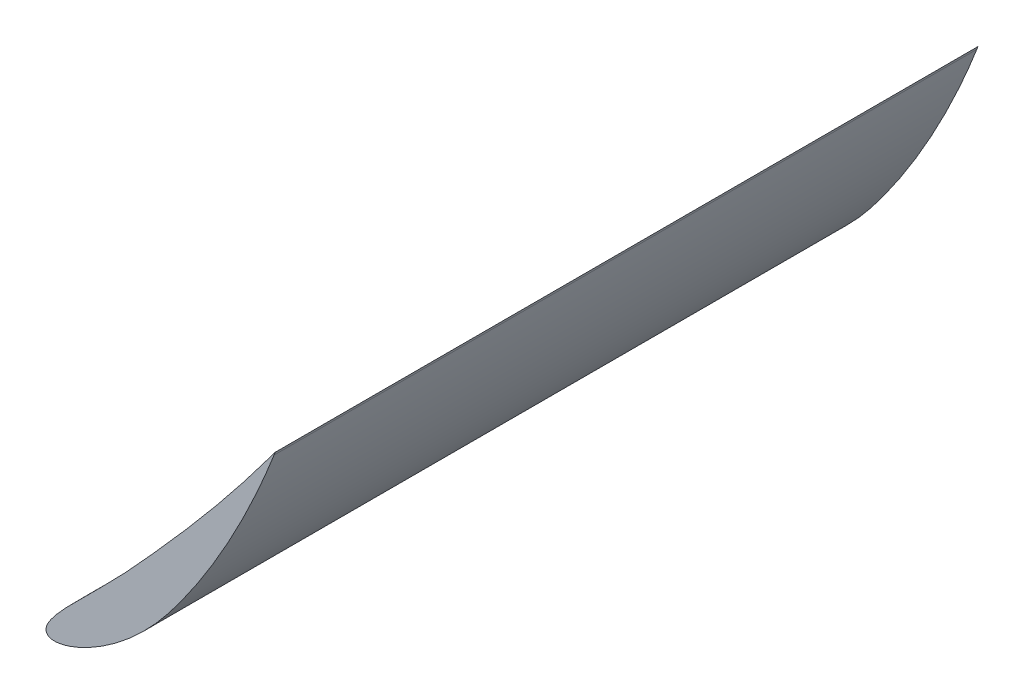
ISO-10303-21;
HEADER;
FILE_DESCRIPTION(('STEP AP214'),'2;1');
FILE_NAME('part.step','',(''),(''),'','','');
FILE_SCHEMA(('AUTOMOTIVE_DESIGN { 1 0 10303 214 1 1 1 1 }'));
ENDSEC;
DATA;
#1=APPLICATION_CONTEXT('core data for automotive mechanical design processes');
#2=APPLICATION_PROTOCOL_DEFINITION('international standard','automotive_design',2000,#1);
#3=PRODUCT_CONTEXT('',#1,'mechanical');
#4=PRODUCT('Part','Part','',(#3));
#5=PRODUCT_RELATED_PRODUCT_CATEGORY('part','',(#4));
#6=PRODUCT_DEFINITION_FORMATION('','',#4);
#7=PRODUCT_DEFINITION_CONTEXT('part definition',#1,'design');
#8=PRODUCT_DEFINITION('design','',#6,#7);
#9=PRODUCT_DEFINITION_SHAPE('','',#8);
#10=(LENGTH_UNIT() NAMED_UNIT(*) SI_UNIT(.MILLI.,.METRE.));
#11=(NAMED_UNIT(*) PLANE_ANGLE_UNIT() SI_UNIT($,.RADIAN.));
#12=(NAMED_UNIT(*) SI_UNIT($,.STERADIAN.) SOLID_ANGLE_UNIT());
#13=UNCERTAINTY_MEASURE_WITH_UNIT(LENGTH_MEASURE(1.E-05),#10,'distance_accuracy_value','');
#14=(GEOMETRIC_REPRESENTATION_CONTEXT(3) GLOBAL_UNCERTAINTY_ASSIGNED_CONTEXT((#13)) GLOBAL_UNIT_ASSIGNED_CONTEXT((#10,
#11,#12)) REPRESENTATION_CONTEXT('',''));
#15=CARTESIAN_POINT('',(0.,0.,0.));
#16=DIRECTION('',(0.,0.,1.));
#17=DIRECTION('',(1.,0.,0.));
#18=AXIS2_PLACEMENT_3D('',#15,#16,#17);
#19=CARTESIAN_POINT('',(81.5114443447214,97.3905028588164,254.));
#20=CARTESIAN_POINT('',(81.4724993485904,97.3380225949964,254.));
#21=CARTESIAN_POINT('',(81.3169275021705,97.1283820158827,254.));
#22=CARTESIAN_POINT('',(80.9673240105217,96.6582939535566,254.));
#23=CARTESIAN_POINT('',(80.3866634497469,95.8783557208886,254.));
#24=CARTESIAN_POINT('',(79.5770452474424,94.7946632231762,254.));
#25=CARTESIAN_POINT('',(78.5420168819517,93.4150335321202,254.));
#26=CARTESIAN_POINT('',(77.2860055830287,91.7496774249786,254.));
#27=CARTESIAN_POINT('',(75.8139822007674,89.8110857143278,254.));
#28=CARTESIAN_POINT('',(74.1325354546525,87.613424091183,254.));
#29=CARTESIAN_POINT('',(72.2484756306876,85.1731057009787,254.));
#30=CARTESIAN_POINT('',(70.1703117098981,82.50787747609,254.));
#31=CARTESIAN_POINT('',(67.9066182566049,79.6376394273431,254.));
#32=CARTESIAN_POINT('',(65.4680439404069,76.5828753592969,254.));
#33=CARTESIAN_POINT('',(62.8659029490476,73.3655234144289,254.));
#34=CARTESIAN_POINT('',(60.1132970015821,70.0079239798087,254.));
#35=CARTESIAN_POINT('',(57.2240039346889,66.5334424291224,254.));
#36=CARTESIAN_POINT('',(54.2144334942381,62.96474757835,254.));
#37=CARTESIAN_POINT('',(51.1016295950619,59.3250196994076,254.));
#38=CARTESIAN_POINT('',(47.9048789148053,55.6367857888687,254.));
#39=CARTESIAN_POINT('',(44.6451849265617,51.9215492818971,254.));
#40=CARTESIAN_POINT('',(41.3442542622643,48.2009899730017,254.));
#41=CARTESIAN_POINT('',(38.0268826260614,44.4942411623319,254.));
#42=CARTESIAN_POINT('',(34.7151331807134,40.8229057150117,254.));
#43=CARTESIAN_POINT('',(31.4437054803424,37.1956194014617,254.));
#44=CARTESIAN_POINT('',(28.1716511772478,33.6891442729693,254.));
#45=CARTESIAN_POINT('',(24.932967555357,30.3129564992276,254.));
#46=CARTESIAN_POINT('',(21.758461337952,27.07840075117,254.));
#47=CARTESIAN_POINT('',(18.6806065390283,23.99459195036,254.));
#48=CARTESIAN_POINT('',(15.7314203046248,21.0695133397679,254.));
#49=CARTESIAN_POINT('',(12.9427394417453,18.3096104806905,254.));
#50=CARTESIAN_POINT('',(10.3447106753028,15.720915973445,254.));
#51=CARTESIAN_POINT('',(7.96645250791334,13.3081145250547,254.));
#52=CARTESIAN_POINT('',(5.83397860759422,11.0762653040549,254.));
#53=CARTESIAN_POINT('',(3.97180123719726,9.02907640368467,254.));
#54=CARTESIAN_POINT('',(2.40061268825875,7.17037548642023,254.));
#55=CARTESIAN_POINT('',(1.13795411614937,5.50312304824638,254.));
#56=CARTESIAN_POINT('',(0.19681882395866,4.02854127904625,254.));
#57=CARTESIAN_POINT('',(-0.413303284672036,2.74288328759789,254.));
#58=CARTESIAN_POINT('',(-0.688610929821684,1.63206193677366,254.));
#59=CARTESIAN_POINT('',(-0.579008281907848,0.660655586252463,254.));
#60=CARTESIAN_POINT('',(-0.0134011427764929,-0.0818041355543678,254.));
#61=CARTESIAN_POINT('',(0.896547455100259,-0.525082577925548,254.));
#62=CARTESIAN_POINT('',(2.08995470990216,-0.70090976106328,254.));
#63=CARTESIAN_POINT('',(3.56512361435437,-0.632851232227053,254.));
#64=CARTESIAN_POINT('',(5.32149888486683,-0.320057439987322,254.));
#65=CARTESIAN_POINT('',(7.34744690524268,0.24221948406911,254.));
#66=CARTESIAN_POINT('',(9.62319691470616,1.06131285816104,254.));
#67=CARTESIAN_POINT('',(12.1246315617059,2.14234662593275,254.));
#68=CARTESIAN_POINT('',(14.8236928496753,3.49099214761592,254.));
#69=CARTESIAN_POINT('',(17.6904455460227,5.1107765009438,254.));
#70=CARTESIAN_POINT('',(20.6931764793886,7.00404357681996,254.));
#71=CARTESIAN_POINT('',(23.7993302752157,9.17140481500113,254.));
#72=CARTESIAN_POINT('',(26.9767119809022,11.6104836738929,254.));
#73=CARTESIAN_POINT('',(30.1932055782101,14.3169861719891,254.));
#74=CARTESIAN_POINT('',(33.4182576468334,17.2830944674386,254.));
#75=CARTESIAN_POINT('',(36.6226503417438,20.4983758726719,254.));
#76=CARTESIAN_POINT('',(39.7791575955464,23.9490027515403,254.));
#77=CARTESIAN_POINT('',(42.8637366967823,27.6176498034923,254.));
#78=CARTESIAN_POINT('',(45.8490898411598,31.4846984197122,254.));
#79=CARTESIAN_POINT('',(48.7893665464502,35.46928923033,254.));
#80=CARTESIAN_POINT('',(51.6592639694838,39.5528452886545,254.));
#81=CARTESIAN_POINT('',(54.4471040122348,43.7050018335014,254.));
#82=CARTESIAN_POINT('',(57.1391174349378,47.8972665535146,254.));
#83=CARTESIAN_POINT('',(59.7244179754428,52.0990676484749,254.));
#84=CARTESIAN_POINT('',(62.192043894171,56.280367272314,254.));
#85=CARTESIAN_POINT('',(64.5329216403351,60.4101269630912,254.));
#86=CARTESIAN_POINT('',(66.739420350541,64.4573537053987,254.));
#87=CARTESIAN_POINT('',(68.8046325048255,68.3913550659394,254.));
#88=CARTESIAN_POINT('',(70.7234345865299,72.1816303783074,254.));
#89=CARTESIAN_POINT('',(72.4911532749747,75.7986432311616,254.));
#90=CARTESIAN_POINT('',(74.1049505837917,79.2134067515902,254.));
#91=CARTESIAN_POINT('',(75.5631746179724,82.3980510598884,254.));
#92=CARTESIAN_POINT('',(76.8643313481184,85.3265203790449,254.));
#93=CARTESIAN_POINT('',(78.0085992110134,87.973973911574,254.));
#94=CARTESIAN_POINT('',(78.9965168529997,90.3178191920207,254.));
#95=CARTESIAN_POINT('',(79.8290460209963,92.3376130309086,254.));
#96=CARTESIAN_POINT('',(80.5075030110648,94.0156040681828,254.));
#97=CARTESIAN_POINT('',(81.0333649450308,95.3367164755295,254.));
#98=CARTESIAN_POINT('',(81.407728168615,96.2891718618192,254.));
#99=CARTESIAN_POINT('',(81.6321320939617,96.8640427065085,254.));
#100=CARTESIAN_POINT('',(81.7316792002867,97.1205494069967,254.));
#101=CARTESIAN_POINT('',(81.7566085156607,97.1847856934033,254.));
#102=B_SPLINE_CURVE_WITH_KNOTS('',3,(#19,#20,#21,#22,#23,#24,#25,#26,#27,#28,#29,#30,#31,#32,
#33,#34,#35,#36,#37,#38,#39,#40,#41,#42,#43,#44,#45,#46,#47,#48,#49,#50,#51,#52,#53,#54,#55,#56,
#57,#58,#59,#60,#61,#62,#63,#64,#65,#66,#67,#68,#69,#70,#71,#72,#73,#74,#75,#76,#77,#78,#79,#80,
#81,#82,#83,#84,#85,#86,#87,#88,#89,#90,#91,#92,#93,#94,#95,#96,#97,#98,#99,#100,#101),
.UNSPECIFIED.,.F.,.F.,(4,1,1,1,1,1,1,1,1,1,1,1,1,1,1,1,1,1,1,1,1,1,1,1,1,1,1,1,1,1,1,1,1,1,1,1,
1,1,1,1,1,1,1,1,1,1,1,1,1,1,1,1,1,1,1,1,1,1,1,1,1,1,1,1,1,1,1,1,1,1,1,1,1,1,1,1,1,1,1,1,4),(0.,
0.000750513501971195,0.00299804295428685,0.00672784940377236,0.0119171706525508,
0.0185329713263098,0.026534805613309,0.0358719389384909,0.0464868619139933,0.0583128283132623,
0.0712773849994469,0.0852994283936014,0.100292782778247,0.116165673834452,0.132819784938735,
0.150153116370067,0.168060493162749,0.18643095732459,0.205153508431755,0.224112105695577,
0.243191419595248,0.262273248918981,0.281238994312411,0.299973133201852,0.318367875682616,
0.336314444831389,0.353699728178519,0.370414229508711,0.386350073996083,0.401402198899796,
0.415472291888822,0.428468847070347,0.440308267572275,0.450919872749776,0.460245935875565,
0.468249663818777,0.47492187606895,0.480303629236668,0.484529405053291,0.487929891183724,
0.49113735242087,0.494782629666708,0.49927184258141,0.504867269579987,0.511674811850919,
0.519719915105306,0.528985613085521,0.539430032020974,0.550996930431098,0.563619975082369,
0.577228754188619,0.591747770545967,0.607101620883268,0.623214138669307,0.640007660113029,
0.657405010167299,0.675329003903349,0.693698678149423,0.712431881974785,0.731423114535592,
0.750564737004094,0.769745998457317,0.788854221163154,0.807776971836167,0.826399187090761,
0.844608489708695,0.862290408781229,0.879334612387501,0.895632214479611,0.911076793640884,
0.925566896965723,0.939005567967945,0.951300576603228,0.962367399370791,0.972127178235692,
0.9805106388094,0.987455983158366,0.992912933292426,0.996840179326193,0.999208694566608,1.),.UNSPECIFIED.);
#103=DIRECTION('',(0.,0.,-1.));
#104=VECTOR('',#103,1.);
#105=SURFACE_OF_LINEAR_EXTRUSION('',#102,#104);
#106=CARTESIAN_POINT('',(81.5114443447214,97.3905028588164,0.));
#107=CARTESIAN_POINT('',(81.4724993485904,97.3380225949964,0.));
#108=CARTESIAN_POINT('',(81.3169275021705,97.1283820158827,0.));
#109=CARTESIAN_POINT('',(80.9673240105217,96.6582939535566,0.));
#110=CARTESIAN_POINT('',(80.3866634497469,95.8783557208886,0.));
#111=CARTESIAN_POINT('',(79.5770452474424,94.7946632231762,0.));
#112=CARTESIAN_POINT('',(78.5420168819517,93.4150335321202,0.));
#113=CARTESIAN_POINT('',(77.2860055830287,91.7496774249786,0.));
#114=CARTESIAN_POINT('',(75.8139822007674,89.8110857143278,0.));
#115=CARTESIAN_POINT('',(74.1325354546525,87.613424091183,0.));
#116=CARTESIAN_POINT('',(72.2484756306876,85.1731057009787,0.));
#117=CARTESIAN_POINT('',(70.1703117098981,82.50787747609,0.));
#118=CARTESIAN_POINT('',(67.9066182566049,79.6376394273431,0.));
#119=CARTESIAN_POINT('',(65.4680439404069,76.5828753592969,0.));
#120=CARTESIAN_POINT('',(62.8659029490476,73.3655234144289,0.));
#121=CARTESIAN_POINT('',(60.1132970015821,70.0079239798087,0.));
#122=CARTESIAN_POINT('',(57.2240039346889,66.5334424291224,0.));
#123=CARTESIAN_POINT('',(54.2144334942381,62.96474757835,0.));
#124=CARTESIAN_POINT('',(51.1016295950619,59.3250196994076,0.));
#125=CARTESIAN_POINT('',(47.9048789148053,55.6367857888687,0.));
#126=CARTESIAN_POINT('',(44.6451849265617,51.9215492818971,0.));
#127=CARTESIAN_POINT('',(41.3442542622643,48.2009899730017,0.));
#128=CARTESIAN_POINT('',(38.0268826260614,44.4942411623319,0.));
#129=CARTESIAN_POINT('',(34.7151331807134,40.8229057150117,0.));
#130=CARTESIAN_POINT('',(31.4437054803424,37.1956194014617,0.));
#131=CARTESIAN_POINT('',(28.1716511772478,33.6891442729693,0.));
#132=CARTESIAN_POINT('',(24.932967555357,30.3129564992276,0.));
#133=CARTESIAN_POINT('',(21.758461337952,27.07840075117,0.));
#134=CARTESIAN_POINT('',(18.6806065390283,23.99459195036,0.));
#135=CARTESIAN_POINT('',(15.7314203046248,21.0695133397679,0.));
#136=CARTESIAN_POINT('',(12.9427394417453,18.3096104806905,0.));
#137=CARTESIAN_POINT('',(10.3447106753028,15.720915973445,0.));
#138=CARTESIAN_POINT('',(7.96645250791334,13.3081145250547,0.));
#139=CARTESIAN_POINT('',(5.83397860759422,11.0762653040549,0.));
#140=CARTESIAN_POINT('',(3.97180123719726,9.02907640368467,0.));
#141=CARTESIAN_POINT('',(2.40061268825875,7.17037548642023,0.));
#142=CARTESIAN_POINT('',(1.13795411614937,5.50312304824638,0.));
#143=CARTESIAN_POINT('',(0.19681882395866,4.02854127904625,0.));
#144=CARTESIAN_POINT('',(-0.413303284672036,2.74288328759789,0.));
#145=CARTESIAN_POINT('',(-0.688610929821684,1.63206193677366,0.));
#146=CARTESIAN_POINT('',(-0.579008281907848,0.660655586252463,0.));
#147=CARTESIAN_POINT('',(-0.0134011427764929,-0.0818041355543678,0.));
#148=CARTESIAN_POINT('',(0.896547455100259,-0.525082577925548,0.));
#149=CARTESIAN_POINT('',(2.08995470990216,-0.70090976106328,0.));
#150=CARTESIAN_POINT('',(3.56512361435437,-0.632851232227053,0.));
#151=CARTESIAN_POINT('',(5.32149888486683,-0.320057439987322,0.));
#152=CARTESIAN_POINT('',(7.34744690524268,0.24221948406911,0.));
#153=CARTESIAN_POINT('',(9.62319691470616,1.06131285816104,0.));
#154=CARTESIAN_POINT('',(12.1246315617059,2.14234662593275,0.));
#155=CARTESIAN_POINT('',(14.8236928496753,3.49099214761592,0.));
#156=CARTESIAN_POINT('',(17.6904455460227,5.1107765009438,0.));
#157=CARTESIAN_POINT('',(20.6931764793886,7.00404357681996,0.));
#158=CARTESIAN_POINT('',(23.7993302752157,9.17140481500113,0.));
#159=CARTESIAN_POINT('',(26.9767119809022,11.6104836738929,0.));
#160=CARTESIAN_POINT('',(30.1932055782101,14.3169861719891,0.));
#161=CARTESIAN_POINT('',(33.4182576468334,17.2830944674386,0.));
#162=CARTESIAN_POINT('',(36.6226503417438,20.4983758726719,0.));
#163=CARTESIAN_POINT('',(39.7791575955464,23.9490027515403,0.));
#164=CARTESIAN_POINT('',(42.8637366967823,27.6176498034923,0.));
#165=CARTESIAN_POINT('',(45.8490898411598,31.4846984197122,0.));
#166=CARTESIAN_POINT('',(48.7893665464502,35.46928923033,0.));
#167=CARTESIAN_POINT('',(51.6592639694838,39.5528452886545,0.));
#168=CARTESIAN_POINT('',(54.4471040122348,43.7050018335014,0.));
#169=CARTESIAN_POINT('',(57.1391174349378,47.8972665535146,0.));
#170=CARTESIAN_POINT('',(59.7244179754428,52.0990676484749,0.));
#171=CARTESIAN_POINT('',(62.192043894171,56.280367272314,0.));
#172=CARTESIAN_POINT('',(64.5329216403351,60.4101269630912,0.));
#173=CARTESIAN_POINT('',(66.739420350541,64.4573537053987,0.));
#174=CARTESIAN_POINT('',(68.8046325048255,68.3913550659394,0.));
#175=CARTESIAN_POINT('',(70.7234345865299,72.1816303783074,0.));
#176=CARTESIAN_POINT('',(72.4911532749747,75.7986432311616,0.));
#177=CARTESIAN_POINT('',(74.1049505837917,79.2134067515902,0.));
#178=CARTESIAN_POINT('',(75.5631746179724,82.3980510598884,0.));
#179=CARTESIAN_POINT('',(76.8643313481184,85.3265203790449,0.));
#180=CARTESIAN_POINT('',(78.0085992110134,87.973973911574,0.));
#181=CARTESIAN_POINT('',(78.9965168529997,90.3178191920207,0.));
#182=CARTESIAN_POINT('',(79.8290460209963,92.3376130309086,0.));
#183=CARTESIAN_POINT('',(80.5075030110648,94.0156040681828,0.));
#184=CARTESIAN_POINT('',(81.0333649450308,95.3367164755295,0.));
#185=CARTESIAN_POINT('',(81.407728168615,96.2891718618192,0.));
#186=CARTESIAN_POINT('',(81.6321320939617,96.8640427065085,0.));
#187=CARTESIAN_POINT('',(81.7316792002867,97.1205494069967,0.));
#188=CARTESIAN_POINT('',(81.7566085156607,97.1847856934033,0.));
#189=B_SPLINE_CURVE_WITH_KNOTS('',3,(#106,#107,#108,#109,#110,#111,#112,#113,#114,#115,#116,
#117,#118,#119,#120,#121,#122,#123,#124,#125,#126,#127,#128,#129,#130,#131,#132,#133,#134,#135,
#136,#137,#138,#139,#140,#141,#142,#143,#144,#145,#146,#147,#148,#149,#150,#151,#152,#153,#154,
#155,#156,#157,#158,#159,#160,#161,#162,#163,#164,#165,#166,#167,#168,#169,#170,#171,#172,#173,
#174,#175,#176,#177,#178,#179,#180,#181,#182,#183,#184,#185,#186,#187,#188),.UNSPECIFIED.,.F.,
.F.,(4,1,1,1,1,1,1,1,1,1,1,1,1,1,1,1,1,1,1,1,1,1,1,1,1,1,1,1,1,1,1,1,1,1,1,1,1,1,1,1,1,1,1,1,1,
1,1,1,1,1,1,1,1,1,1,1,1,1,1,1,1,1,1,1,1,1,1,1,1,1,1,1,1,1,1,1,1,1,1,1,4),(0.,
0.000750513501971195,0.00299804295428685,0.00672784940377236,0.0119171706525508,
0.0185329713263098,0.026534805613309,0.0358719389384909,0.0464868619139933,0.0583128283132623,
0.0712773849994469,0.0852994283936014,0.100292782778247,0.116165673834452,0.132819784938735,
0.150153116370067,0.168060493162749,0.18643095732459,0.205153508431755,0.224112105695577,
0.243191419595248,0.262273248918981,0.281238994312411,0.299973133201852,0.318367875682616,
0.336314444831389,0.353699728178519,0.370414229508711,0.386350073996083,0.401402198899796,
0.415472291888822,0.428468847070347,0.440308267572275,0.450919872749776,0.460245935875565,
0.468249663818777,0.47492187606895,0.480303629236668,0.484529405053291,0.487929891183724,
0.49113735242087,0.494782629666708,0.49927184258141,0.504867269579987,0.511674811850919,
0.519719915105306,0.528985613085521,0.539430032020974,0.550996930431098,0.563619975082369,
0.577228754188619,0.591747770545967,0.607101620883268,0.623214138669307,0.640007660113029,
0.657405010167299,0.675329003903349,0.693698678149423,0.712431881974785,0.731423114535592,
0.750564737004094,0.769745998457317,0.788854221163154,0.807776971836167,0.826399187090761,
0.844608489708695,0.862290408781229,0.879334612387501,0.895632214479611,0.911076793640884,
0.925566896965723,0.939005567967945,0.951300576603228,0.962367399370791,0.972127178235692,
0.9805106388094,0.987455983158366,0.992912933292426,0.996840179326193,0.999208694566608,1.),.UNSPECIFIED.);
#190=CARTESIAN_POINT('',(81.5114443447213,97.3905028588163,0.));
#191=VERTEX_POINT('',#190);
#192=CARTESIAN_POINT('',(81.7566085156607,97.1847856934032,0.));
#193=VERTEX_POINT('',#192);
#194=EDGE_CURVE('E79',#191,#193,#189,.T.);
#195=ORIENTED_EDGE('',*,*,#194,.T.);
#196=DIRECTION('',(0.,0.,-1.));
#197=VECTOR('',#196,1.);
#198=CARTESIAN_POINT('',(81.7566085156607,97.1847856934032,254.));
#199=LINE('',#198,#197);
#200=CARTESIAN_POINT('',(81.7566085156607,97.1847856934032,254.));
#201=VERTEX_POINT('',#200);
#202=EDGE_CURVE('E11',#201,#193,#199,.T.);
#203=ORIENTED_EDGE('',*,*,#202,.F.);
#204=CARTESIAN_POINT('',(81.5114443447213,97.3905028588163,254.));
#205=VERTEX_POINT('',#204);
#206=EDGE_CURVE('E73',#205,#201,#102,.T.);
#207=ORIENTED_EDGE('',*,*,#206,.F.);
#208=DIRECTION('',(0.,0.,-1.));
#209=VECTOR('',#208,1.);
#210=CARTESIAN_POINT('',(81.5114443447213,97.3905028588163,254.));
#211=LINE('',#210,#209);
#212=EDGE_CURVE('E80',#205,#191,#211,.T.);
#213=ORIENTED_EDGE('',*,*,#212,.T.);
#214=EDGE_LOOP('',(#195,#203,#207,#213));
#215=FACE_BOUND('',#214,.T.);
#216=ADVANCED_FACE('F32',(#215),#105,.F.);
#217=CARTESIAN_POINT('',(81.7566085156607,97.1847856934032,254.));
#218=DIRECTION('',(-0.932256741043417,0.361797414002792,0.));
#219=DIRECTION('',(-0.361797414002792,-0.932256741043417,0.));
#220=AXIS2_PLACEMENT_3D('',#217,#218,#219);
#221=PLANE('',#220);
#222=DIRECTION('',(0.361797414002792,0.932256741043417,0.));
#223=VECTOR('',#222,1.);
#224=CARTESIAN_POINT('',(81.7566085156607,97.1847856934032,0.));
#225=LINE('',#224,#223);
#226=CARTESIAN_POINT('',(82.1927399139845,98.3085815535498,0.));
#227=VERTEX_POINT('',#226);
#228=EDGE_CURVE('E61',#193,#227,#225,.T.);
#229=ORIENTED_EDGE('',*,*,#228,.T.);
#230=DIRECTION('',(0.,0.,-1.));
#231=VECTOR('',#230,1.);
#232=CARTESIAN_POINT('',(82.1927399139845,98.3085815535498,254.));
#233=LINE('',#232,#231);
#234=CARTESIAN_POINT('',(82.1927399139845,98.3085815535498,254.));
#235=VERTEX_POINT('',#234);
#236=EDGE_CURVE('E41',#235,#227,#233,.T.);
#237=ORIENTED_EDGE('',*,*,#236,.F.);
#238=DIRECTION('',(0.361797414002792,0.932256741043417,0.));
#239=VECTOR('',#238,1.);
#240=CARTESIAN_POINT('',(81.7566085156607,97.1847856934032,254.));
#241=LINE('',#240,#239);
#242=EDGE_CURVE('E69',#201,#235,#241,.T.);
#243=ORIENTED_EDGE('',*,*,#242,.F.);
#244=ORIENTED_EDGE('',*,*,#202,.T.);
#245=EDGE_LOOP('',(#229,#237,#243,#244));
#246=FACE_BOUND('',#245,.T.);
#247=ADVANCED_FACE('F70',(#246),#221,.F.);
#248=CARTESIAN_POINT('',(81.5114443447213,97.3905028588163,254.));
#249=DIRECTION('',(0.803039254555515,-0.595926132706834,0.));
#250=DIRECTION('',(0.595926132706834,0.803039254555515,0.));
#251=AXIS2_PLACEMENT_3D('',#248,#249,#250);
#252=PLANE('',#251);
#253=DIRECTION('',(-0.595926132706834,-0.803039254555515,0.));
#254=VECTOR('',#253,1.);
#255=CARTESIAN_POINT('',(81.5114443447213,97.3905028588163,0.));
#256=LINE('',#255,#254);
#257=EDGE_CURVE('E66',#227,#191,#256,.T.);
#258=ORIENTED_EDGE('',*,*,#257,.T.);
#259=ORIENTED_EDGE('',*,*,#212,.F.);
#260=DIRECTION('',(-0.595926132706834,-0.803039254555515,0.));
#261=VECTOR('',#260,1.);
#262=CARTESIAN_POINT('',(81.5114443447213,97.3905028588163,254.));
#263=LINE('',#262,#261);
#264=EDGE_CURVE('E49',#235,#205,#263,.T.);
#265=ORIENTED_EDGE('',*,*,#264,.F.);
#266=ORIENTED_EDGE('',*,*,#236,.T.);
#267=EDGE_LOOP('',(#258,#259,#265,#266));
#268=FACE_BOUND('',#267,.T.);
#269=ADVANCED_FACE('F92',(#268),#252,.F.);
#270=CARTESIAN_POINT('',(2.18494371724894,-0.662101143587484,254.));
#271=DIRECTION('',(0.,0.,1.));
#272=DIRECTION('',(1.,0.,0.));
#273=AXIS2_PLACEMENT_3D('',#270,#271,#272);
#274=PLANE('',#273);
#275=ORIENTED_EDGE('',*,*,#206,.T.);
#276=ORIENTED_EDGE('',*,*,#242,.T.);
#277=ORIENTED_EDGE('',*,*,#264,.T.);
#278=EDGE_LOOP('',(#275,#276,#277));
#279=FACE_BOUND('',#278,.T.);
#280=ADVANCED_FACE('F76',(#279),#274,.T.);
#281=CARTESIAN_POINT('',(2.18494371724894,-0.662101143587484,0.));
#282=DIRECTION('',(0.,0.,1.));
#283=DIRECTION('',(1.,0.,0.));
#284=AXIS2_PLACEMENT_3D('',#281,#282,#283);
#285=PLANE('',#284);
#286=ORIENTED_EDGE('',*,*,#194,.F.);
#287=ORIENTED_EDGE('',*,*,#257,.F.);
#288=ORIENTED_EDGE('',*,*,#228,.F.);
#289=EDGE_LOOP('',(#286,#287,#288));
#290=FACE_BOUND('',#289,.T.);
#291=ADVANCED_FACE('F93',(#290),#285,.F.);
#292=CLOSED_SHELL('',(#216,#247,#269,#280,#291));
#293=MANIFOLD_SOLID_BREP('B2',#292);
#294=ADVANCED_BREP_SHAPE_REPRESENTATION('',(#18,#293),#14);
#295=SHAPE_DEFINITION_REPRESENTATION(#9,#294);
ENDSEC;
END-ISO-10303-21;
